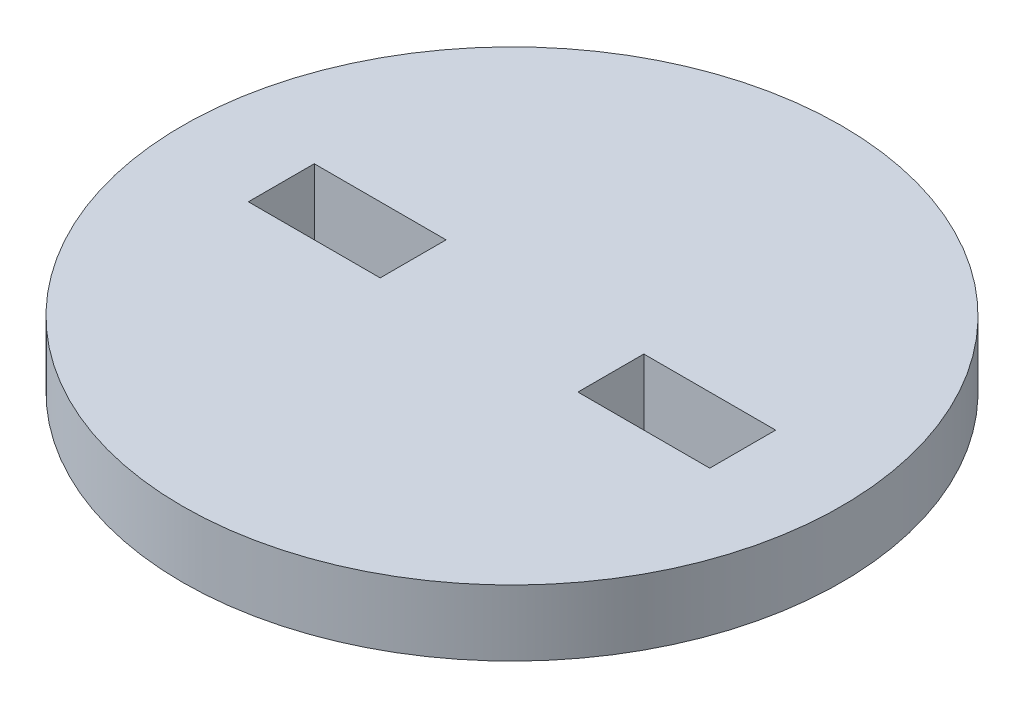
ISO-10303-21;
HEADER;
FILE_DESCRIPTION(('STEP AP214'),'2;1');
FILE_NAME('part.step','',(''),(''),'','','');
FILE_SCHEMA(('AUTOMOTIVE_DESIGN { 1 0 10303 214 1 1 1 1 }'));
ENDSEC;
DATA;
#1=APPLICATION_CONTEXT('core data for automotive mechanical design processes');
#2=APPLICATION_PROTOCOL_DEFINITION('international standard','automotive_design',2000,#1);
#3=PRODUCT_CONTEXT('',#1,'mechanical');
#4=PRODUCT('Part','Part','',(#3));
#5=PRODUCT_RELATED_PRODUCT_CATEGORY('part','',(#4));
#6=PRODUCT_DEFINITION_FORMATION('','',#4);
#7=PRODUCT_DEFINITION_CONTEXT('part definition',#1,'design');
#8=PRODUCT_DEFINITION('design','',#6,#7);
#9=PRODUCT_DEFINITION_SHAPE('','',#8);
#10=(LENGTH_UNIT() NAMED_UNIT(*) SI_UNIT(.MILLI.,.METRE.));
#11=(NAMED_UNIT(*) PLANE_ANGLE_UNIT() SI_UNIT($,.RADIAN.));
#12=(NAMED_UNIT(*) SI_UNIT($,.STERADIAN.) SOLID_ANGLE_UNIT());
#13=UNCERTAINTY_MEASURE_WITH_UNIT(LENGTH_MEASURE(1.E-05),#10,'distance_accuracy_value','');
#14=(GEOMETRIC_REPRESENTATION_CONTEXT(3) GLOBAL_UNCERTAINTY_ASSIGNED_CONTEXT((#13)) GLOBAL_UNIT_ASSIGNED_CONTEXT((#10,
#11,#12)) REPRESENTATION_CONTEXT('',''));
#15=CARTESIAN_POINT('',(0.,0.,0.));
#16=DIRECTION('',(0.,0.,1.));
#17=DIRECTION('',(1.,0.,0.));
#18=AXIS2_PLACEMENT_3D('',#15,#16,#17);
#19=CARTESIAN_POINT('',(0.,4.,0.));
#20=DIRECTION('',(0.,1.,0.));
#21=DIRECTION('',(0.,0.,1.));
#22=AXIS2_PLACEMENT_3D('',#19,#20,#21);
#23=PLANE('',#22);
#24=DIRECTION('',(-1.,0.,0.));
#25=VECTOR('',#24,1.);
#26=CARTESIAN_POINT('',(-14.,4.,-2.));
#27=LINE('',#26,#25);
#28=CARTESIAN_POINT('',(-6.,4.,-2.));
#29=VERTEX_POINT('',#28);
#30=CARTESIAN_POINT('',(-14.,4.,-2.));
#31=VERTEX_POINT('',#30);
#32=EDGE_CURVE('E150',#29,#31,#27,.T.);
#33=ORIENTED_EDGE('',*,*,#32,.F.);
#34=DIRECTION('',(0.,0.,-1.));
#35=VECTOR('',#34,1.);
#36=CARTESIAN_POINT('',(-6.,4.,-2.));
#37=LINE('',#36,#35);
#38=CARTESIAN_POINT('',(-6.,4.,2.));
#39=VERTEX_POINT('',#38);
#40=EDGE_CURVE('E146',#39,#29,#37,.T.);
#41=ORIENTED_EDGE('',*,*,#40,.F.);
#42=DIRECTION('',(1.,0.,0.));
#43=VECTOR('',#42,1.);
#44=CARTESIAN_POINT('',(-14.,4.,2.));
#45=LINE('',#44,#43);
#46=CARTESIAN_POINT('',(-14.,4.,2.));
#47=VERTEX_POINT('',#46);
#48=EDGE_CURVE('E158',#47,#39,#45,.T.);
#49=ORIENTED_EDGE('',*,*,#48,.F.);
#50=DIRECTION('',(0.,0.,1.));
#51=VECTOR('',#50,1.);
#52=CARTESIAN_POINT('',(-14.,4.,-2.));
#53=LINE('',#52,#51);
#54=EDGE_CURVE('E163',#31,#47,#53,.T.);
#55=ORIENTED_EDGE('',*,*,#54,.F.);
#56=EDGE_LOOP('',(#33,#41,#49,#55));
#57=FACE_BOUND('',#56,.T.);
#58=CARTESIAN_POINT('',(0.,4.,0.));
#59=DIRECTION('',(0.,1.,0.));
#60=DIRECTION('',(0.,0.,1.));
#61=AXIS2_PLACEMENT_3D('',#58,#59,#60);
#62=CIRCLE('',#61,20.);
#63=CARTESIAN_POINT('',(0.,4.,20.));
#64=VERTEX_POINT('',#63);
#65=EDGE_CURVE('E12',#64,#64,#62,.T.);
#66=ORIENTED_EDGE('',*,*,#65,.T.);
#67=EDGE_LOOP('',(#66));
#68=FACE_BOUND('',#67,.T.);
#69=DIRECTION('',(-1.,0.,0.));
#70=VECTOR('',#69,1.);
#71=CARTESIAN_POINT('',(14.,4.,-2.));
#72=LINE('',#71,#70);
#73=CARTESIAN_POINT('',(14.,4.,-2.));
#74=VERTEX_POINT('',#73);
#75=CARTESIAN_POINT('',(6.,4.,-2.));
#76=VERTEX_POINT('',#75);
#77=EDGE_CURVE('E108',#74,#76,#72,.T.);
#78=ORIENTED_EDGE('',*,*,#77,.F.);
#79=DIRECTION('',(0.,0.,-1.));
#80=VECTOR('',#79,1.);
#81=CARTESIAN_POINT('',(14.,4.,-2.));
#82=LINE('',#81,#80);
#83=CARTESIAN_POINT('',(14.,4.,2.));
#84=VERTEX_POINT('',#83);
#85=EDGE_CURVE('E99',#84,#74,#82,.T.);
#86=ORIENTED_EDGE('',*,*,#85,.F.);
#87=DIRECTION('',(1.,0.,0.));
#88=VECTOR('',#87,1.);
#89=CARTESIAN_POINT('',(14.,4.,2.));
#90=LINE('',#89,#88);
#91=CARTESIAN_POINT('',(6.,4.,2.));
#92=VERTEX_POINT('',#91);
#93=EDGE_CURVE('E124',#92,#84,#90,.T.);
#94=ORIENTED_EDGE('',*,*,#93,.F.);
#95=DIRECTION('',(0.,0.,1.));
#96=VECTOR('',#95,1.);
#97=CARTESIAN_POINT('',(6.,4.,-2.));
#98=LINE('',#97,#96);
#99=EDGE_CURVE('E120',#76,#92,#98,.T.);
#100=ORIENTED_EDGE('',*,*,#99,.F.);
#101=EDGE_LOOP('',(#78,#86,#94,#100));
#102=FACE_BOUND('',#101,.T.);
#103=ADVANCED_FACE('F33',(#57,#68,#102),#23,.T.);
#104=CARTESIAN_POINT('',(0.,0.,0.));
#105=DIRECTION('',(0.,1.,0.));
#106=DIRECTION('',(0.,0.,1.));
#107=AXIS2_PLACEMENT_3D('',#104,#105,#106);
#108=PLANE('',#107);
#109=DIRECTION('',(0.,0.,-1.));
#110=VECTOR('',#109,1.);
#111=CARTESIAN_POINT('',(-6.,0.,-2.));
#112=LINE('',#111,#110);
#113=CARTESIAN_POINT('',(-6.,0.,2.));
#114=VERTEX_POINT('',#113);
#115=CARTESIAN_POINT('',(-6.,0.,-2.));
#116=VERTEX_POINT('',#115);
#117=EDGE_CURVE('E116',#114,#116,#112,.T.);
#118=ORIENTED_EDGE('',*,*,#117,.T.);
#119=DIRECTION('',(-1.,0.,0.));
#120=VECTOR('',#119,1.);
#121=CARTESIAN_POINT('',(-14.,0.,-2.));
#122=LINE('',#121,#120);
#123=CARTESIAN_POINT('',(-14.,0.,-2.));
#124=VERTEX_POINT('',#123);
#125=EDGE_CURVE('E167',#116,#124,#122,.T.);
#126=ORIENTED_EDGE('',*,*,#125,.T.);
#127=DIRECTION('',(0.,0.,1.));
#128=VECTOR('',#127,1.);
#129=CARTESIAN_POINT('',(-14.,0.,-2.));
#130=LINE('',#129,#128);
#131=CARTESIAN_POINT('',(-14.,0.,2.));
#132=VERTEX_POINT('',#131);
#133=EDGE_CURVE('E170',#124,#132,#130,.T.);
#134=ORIENTED_EDGE('',*,*,#133,.T.);
#135=DIRECTION('',(1.,0.,0.));
#136=VECTOR('',#135,1.);
#137=CARTESIAN_POINT('',(-14.,0.,2.));
#138=LINE('',#137,#136);
#139=EDGE_CURVE('E151',#132,#114,#138,.T.);
#140=ORIENTED_EDGE('',*,*,#139,.T.);
#141=EDGE_LOOP('',(#118,#126,#134,#140));
#142=FACE_BOUND('',#141,.T.);
#143=CARTESIAN_POINT('',(0.,0.,0.));
#144=DIRECTION('',(0.,1.,0.));
#145=DIRECTION('',(0.,0.,1.));
#146=AXIS2_PLACEMENT_3D('',#143,#144,#145);
#147=CIRCLE('',#146,20.);
#148=CARTESIAN_POINT('',(0.,0.,20.));
#149=VERTEX_POINT('',#148);
#150=EDGE_CURVE('E37',#149,#149,#147,.T.);
#151=ORIENTED_EDGE('',*,*,#150,.F.);
#152=EDGE_LOOP('',(#151));
#153=FACE_BOUND('',#152,.T.);
#154=DIRECTION('',(0.,0.,-1.));
#155=VECTOR('',#154,1.);
#156=CARTESIAN_POINT('',(14.,0.,-2.));
#157=LINE('',#156,#155);
#158=CARTESIAN_POINT('',(14.,0.,2.));
#159=VERTEX_POINT('',#158);
#160=CARTESIAN_POINT('',(14.,0.,-2.));
#161=VERTEX_POINT('',#160);
#162=EDGE_CURVE('E57',#159,#161,#157,.T.);
#163=ORIENTED_EDGE('',*,*,#162,.T.);
#164=DIRECTION('',(-1.,0.,0.));
#165=VECTOR('',#164,1.);
#166=CARTESIAN_POINT('',(14.,0.,-2.));
#167=LINE('',#166,#165);
#168=CARTESIAN_POINT('',(6.,0.,-2.));
#169=VERTEX_POINT('',#168);
#170=EDGE_CURVE('E115',#161,#169,#167,.T.);
#171=ORIENTED_EDGE('',*,*,#170,.T.);
#172=DIRECTION('',(0.,0.,1.));
#173=VECTOR('',#172,1.);
#174=CARTESIAN_POINT('',(6.,0.,-2.));
#175=LINE('',#174,#173);
#176=CARTESIAN_POINT('',(6.,0.,2.));
#177=VERTEX_POINT('',#176);
#178=EDGE_CURVE('E138',#169,#177,#175,.T.);
#179=ORIENTED_EDGE('',*,*,#178,.T.);
#180=DIRECTION('',(1.,0.,0.));
#181=VECTOR('',#180,1.);
#182=CARTESIAN_POINT('',(14.,0.,2.));
#183=LINE('',#182,#181);
#184=EDGE_CURVE('E109',#177,#159,#183,.T.);
#185=ORIENTED_EDGE('',*,*,#184,.T.);
#186=EDGE_LOOP('',(#163,#171,#179,#185));
#187=FACE_BOUND('',#186,.T.);
#188=ADVANCED_FACE('F190',(#142,#153,#187),#108,.F.);
#189=CARTESIAN_POINT('',(0.,4.,0.));
#190=DIRECTION('',(0.,-1.,0.));
#191=DIRECTION('',(0.,0.,-1.));
#192=AXIS2_PLACEMENT_3D('',#189,#190,#191);
#193=CYLINDRICAL_SURFACE('',#192,20.);
#194=ORIENTED_EDGE('',*,*,#65,.F.);
#195=EDGE_LOOP('',(#194));
#196=FACE_BOUND('',#195,.T.);
#197=ORIENTED_EDGE('',*,*,#150,.T.);
#198=EDGE_LOOP('',(#197));
#199=FACE_BOUND('',#198,.T.);
#200=ADVANCED_FACE('F35',(#196,#199),#193,.T.);
#201=CARTESIAN_POINT('',(-6.,4.,-2.));
#202=DIRECTION('',(-1.,0.,0.));
#203=DIRECTION('',(0.,0.,1.));
#204=AXIS2_PLACEMENT_3D('',#201,#202,#203);
#205=PLANE('',#204);
#206=ORIENTED_EDGE('',*,*,#117,.F.);
#207=DIRECTION('',(0.,-1.,0.));
#208=VECTOR('',#207,1.);
#209=CARTESIAN_POINT('',(-6.,4.,2.));
#210=LINE('',#209,#208);
#211=EDGE_CURVE('E162',#39,#114,#210,.T.);
#212=ORIENTED_EDGE('',*,*,#211,.F.);
#213=ORIENTED_EDGE('',*,*,#40,.T.);
#214=DIRECTION('',(0.,-1.,0.));
#215=VECTOR('',#214,1.);
#216=CARTESIAN_POINT('',(-6.,4.,-2.));
#217=LINE('',#216,#215);
#218=EDGE_CURVE('E181',#29,#116,#217,.T.);
#219=ORIENTED_EDGE('',*,*,#218,.T.);
#220=EDGE_LOOP('',(#206,#212,#213,#219));
#221=FACE_BOUND('',#220,.T.);
#222=ADVANCED_FACE('F212',(#221),#205,.T.);
#223=CARTESIAN_POINT('',(-14.,4.,-2.));
#224=DIRECTION('',(0.,0.,1.));
#225=DIRECTION('',(1.,0.,0.));
#226=AXIS2_PLACEMENT_3D('',#223,#224,#225);
#227=PLANE('',#226);
#228=ORIENTED_EDGE('',*,*,#125,.F.);
#229=ORIENTED_EDGE('',*,*,#218,.F.);
#230=ORIENTED_EDGE('',*,*,#32,.T.);
#231=DIRECTION('',(0.,-1.,0.));
#232=VECTOR('',#231,1.);
#233=CARTESIAN_POINT('',(-14.,4.,-2.));
#234=LINE('',#233,#232);
#235=EDGE_CURVE('E179',#31,#124,#234,.T.);
#236=ORIENTED_EDGE('',*,*,#235,.T.);
#237=EDGE_LOOP('',(#228,#229,#230,#236));
#238=FACE_BOUND('',#237,.T.);
#239=ADVANCED_FACE('F215',(#238),#227,.T.);
#240=CARTESIAN_POINT('',(-14.,4.,-2.));
#241=DIRECTION('',(1.,0.,0.));
#242=DIRECTION('',(0.,0.,-1.));
#243=AXIS2_PLACEMENT_3D('',#240,#241,#242);
#244=PLANE('',#243);
#245=ORIENTED_EDGE('',*,*,#133,.F.);
#246=ORIENTED_EDGE('',*,*,#235,.F.);
#247=ORIENTED_EDGE('',*,*,#54,.T.);
#248=DIRECTION('',(0.,-1.,0.));
#249=VECTOR('',#248,1.);
#250=CARTESIAN_POINT('',(-14.,4.,2.));
#251=LINE('',#250,#249);
#252=EDGE_CURVE('E177',#47,#132,#251,.T.);
#253=ORIENTED_EDGE('',*,*,#252,.T.);
#254=EDGE_LOOP('',(#245,#246,#247,#253));
#255=FACE_BOUND('',#254,.T.);
#256=ADVANCED_FACE('F218',(#255),#244,.T.);
#257=CARTESIAN_POINT('',(-14.,4.,2.));
#258=DIRECTION('',(0.,0.,-1.));
#259=DIRECTION('',(-1.,0.,0.));
#260=AXIS2_PLACEMENT_3D('',#257,#258,#259);
#261=PLANE('',#260);
#262=ORIENTED_EDGE('',*,*,#139,.F.);
#263=ORIENTED_EDGE('',*,*,#252,.F.);
#264=ORIENTED_EDGE('',*,*,#48,.T.);
#265=ORIENTED_EDGE('',*,*,#211,.T.);
#266=EDGE_LOOP('',(#262,#263,#264,#265));
#267=FACE_BOUND('',#266,.T.);
#268=ADVANCED_FACE('F222',(#267),#261,.T.);
#269=CARTESIAN_POINT('',(14.,4.,-2.));
#270=DIRECTION('',(-1.,0.,0.));
#271=DIRECTION('',(0.,0.,1.));
#272=AXIS2_PLACEMENT_3D('',#269,#270,#271);
#273=PLANE('',#272);
#274=ORIENTED_EDGE('',*,*,#162,.F.);
#275=DIRECTION('',(0.,-1.,0.));
#276=VECTOR('',#275,1.);
#277=CARTESIAN_POINT('',(14.,4.,2.));
#278=LINE('',#277,#276);
#279=EDGE_CURVE('E103',#84,#159,#278,.T.);
#280=ORIENTED_EDGE('',*,*,#279,.F.);
#281=ORIENTED_EDGE('',*,*,#85,.T.);
#282=DIRECTION('',(0.,-1.,0.));
#283=VECTOR('',#282,1.);
#284=CARTESIAN_POINT('',(14.,4.,-2.));
#285=LINE('',#284,#283);
#286=EDGE_CURVE('E102',#74,#161,#285,.T.);
#287=ORIENTED_EDGE('',*,*,#286,.T.);
#288=EDGE_LOOP('',(#274,#280,#281,#287));
#289=FACE_BOUND('',#288,.T.);
#290=ADVANCED_FACE('F101',(#289),#273,.T.);
#291=CARTESIAN_POINT('',(14.,4.,-2.));
#292=DIRECTION('',(0.,0.,1.));
#293=DIRECTION('',(1.,0.,0.));
#294=AXIS2_PLACEMENT_3D('',#291,#292,#293);
#295=PLANE('',#294);
#296=ORIENTED_EDGE('',*,*,#170,.F.);
#297=ORIENTED_EDGE('',*,*,#286,.F.);
#298=ORIENTED_EDGE('',*,*,#77,.T.);
#299=DIRECTION('',(0.,-1.,0.));
#300=VECTOR('',#299,1.);
#301=CARTESIAN_POINT('',(6.,4.,-2.));
#302=LINE('',#301,#300);
#303=EDGE_CURVE('E117',#76,#169,#302,.T.);
#304=ORIENTED_EDGE('',*,*,#303,.T.);
#305=EDGE_LOOP('',(#296,#297,#298,#304));
#306=FACE_BOUND('',#305,.T.);
#307=ADVANCED_FACE('F112',(#306),#295,.T.);
#308=CARTESIAN_POINT('',(6.,4.,-2.));
#309=DIRECTION('',(1.,0.,0.));
#310=DIRECTION('',(0.,0.,-1.));
#311=AXIS2_PLACEMENT_3D('',#308,#309,#310);
#312=PLANE('',#311);
#313=ORIENTED_EDGE('',*,*,#178,.F.);
#314=ORIENTED_EDGE('',*,*,#303,.F.);
#315=ORIENTED_EDGE('',*,*,#99,.T.);
#316=DIRECTION('',(0.,-1.,0.));
#317=VECTOR('',#316,1.);
#318=CARTESIAN_POINT('',(6.,4.,2.));
#319=LINE('',#318,#317);
#320=EDGE_CURVE('E49',#92,#177,#319,.T.);
#321=ORIENTED_EDGE('',*,*,#320,.T.);
#322=EDGE_LOOP('',(#313,#314,#315,#321));
#323=FACE_BOUND('',#322,.T.);
#324=ADVANCED_FACE('F197',(#323),#312,.T.);
#325=CARTESIAN_POINT('',(14.,4.,2.));
#326=DIRECTION('',(0.,0.,-1.));
#327=DIRECTION('',(-1.,0.,0.));
#328=AXIS2_PLACEMENT_3D('',#325,#326,#327);
#329=PLANE('',#328);
#330=ORIENTED_EDGE('',*,*,#184,.F.);
#331=ORIENTED_EDGE('',*,*,#320,.F.);
#332=ORIENTED_EDGE('',*,*,#93,.T.);
#333=ORIENTED_EDGE('',*,*,#279,.T.);
#334=EDGE_LOOP('',(#330,#331,#332,#333));
#335=FACE_BOUND('',#334,.T.);
#336=ADVANCED_FACE('F195',(#335),#329,.T.);
#337=CLOSED_SHELL('',(#103,#188,#200,#222,#239,#256,#268,#290,#307,#324,#336));
#338=MANIFOLD_SOLID_BREP('B2',#337);
#339=ADVANCED_BREP_SHAPE_REPRESENTATION('',(#18,#338),#14);
#340=SHAPE_DEFINITION_REPRESENTATION(#9,#339);
ENDSEC;
END-ISO-10303-21;
